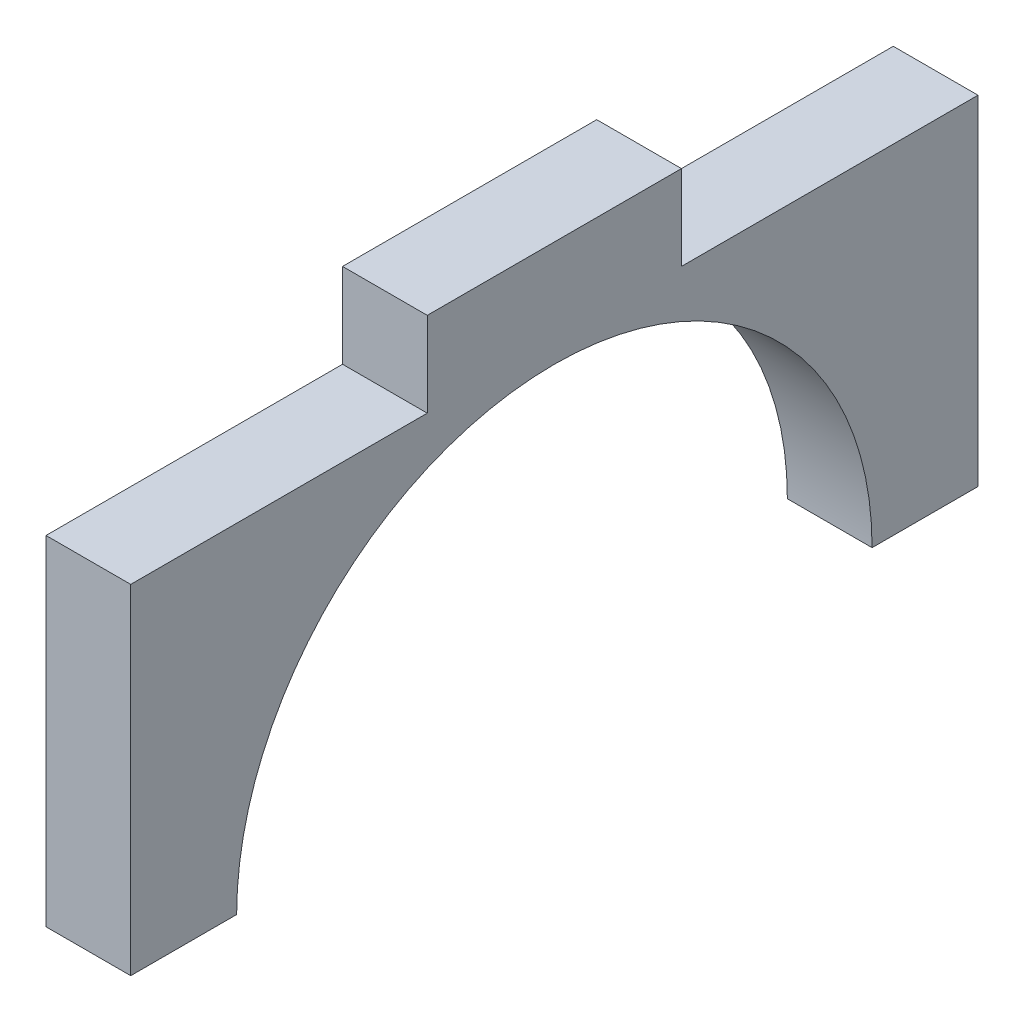
ISO-10303-21;
HEADER;
FILE_DESCRIPTION(('STEP AP214'),'2;1');
FILE_NAME('part.step','',(''),(''),'','','');
FILE_SCHEMA(('AUTOMOTIVE_DESIGN { 1 0 10303 214 1 1 1 1 }'));
ENDSEC;
DATA;
#1=APPLICATION_CONTEXT('core data for automotive mechanical design processes');
#2=APPLICATION_PROTOCOL_DEFINITION('international standard','automotive_design',2000,#1);
#3=PRODUCT_CONTEXT('',#1,'mechanical');
#4=PRODUCT('Part','Part','',(#3));
#5=PRODUCT_RELATED_PRODUCT_CATEGORY('part','',(#4));
#6=PRODUCT_DEFINITION_FORMATION('','',#4);
#7=PRODUCT_DEFINITION_CONTEXT('part definition',#1,'design');
#8=PRODUCT_DEFINITION('design','',#6,#7);
#9=PRODUCT_DEFINITION_SHAPE('','',#8);
#10=(LENGTH_UNIT() NAMED_UNIT(*) SI_UNIT(.MILLI.,.METRE.));
#11=(NAMED_UNIT(*) PLANE_ANGLE_UNIT() SI_UNIT($,.RADIAN.));
#12=(NAMED_UNIT(*) SI_UNIT($,.STERADIAN.) SOLID_ANGLE_UNIT());
#13=UNCERTAINTY_MEASURE_WITH_UNIT(LENGTH_MEASURE(1.E-05),#10,'distance_accuracy_value','');
#14=(GEOMETRIC_REPRESENTATION_CONTEXT(3) GLOBAL_UNCERTAINTY_ASSIGNED_CONTEXT((#13)) GLOBAL_UNIT_ASSIGNED_CONTEXT((#10,
#11,#12)) REPRESENTATION_CONTEXT('',''));
#15=CARTESIAN_POINT('',(0.,0.,0.));
#16=DIRECTION('',(0.,0.,1.));
#17=DIRECTION('',(1.,0.,0.));
#18=AXIS2_PLACEMENT_3D('',#15,#16,#17);
#19=CARTESIAN_POINT('',(3.175,0.,0.));
#20=DIRECTION('',(0.,0.,-1.));
#21=DIRECTION('',(-1.,0.,0.));
#22=AXIS2_PLACEMENT_3D('',#19,#20,#21);
#23=PLANE('',#22);
#24=DIRECTION('',(0.,-1.,0.));
#25=VECTOR('',#24,1.);
#26=CARTESIAN_POINT('',(0.,0.,0.));
#27=LINE('',#26,#25);
#28=CARTESIAN_POINT('',(0.,12.7,0.));
#29=VERTEX_POINT('',#28);
#30=CARTESIAN_POINT('',(0.,0.,0.));
#31=VERTEX_POINT('',#30);
#32=EDGE_CURVE('E141',#29,#31,#27,.T.);
#33=ORIENTED_EDGE('',*,*,#32,.T.);
#34=DIRECTION('',(-1.,0.,0.));
#35=VECTOR('',#34,1.);
#36=CARTESIAN_POINT('',(3.175,0.,0.));
#37=LINE('',#36,#35);
#38=CARTESIAN_POINT('',(3.175,0.,0.));
#39=VERTEX_POINT('',#38);
#40=EDGE_CURVE('E11',#39,#31,#37,.T.);
#41=ORIENTED_EDGE('',*,*,#40,.F.);
#42=DIRECTION('',(0.,-1.,0.));
#43=VECTOR('',#42,1.);
#44=CARTESIAN_POINT('',(3.175,0.,0.));
#45=LINE('',#44,#43);
#46=CARTESIAN_POINT('',(3.175,12.7,0.));
#47=VERTEX_POINT('',#46);
#48=EDGE_CURVE('E159',#47,#39,#45,.T.);
#49=ORIENTED_EDGE('',*,*,#48,.F.);
#50=DIRECTION('',(-1.,0.,0.));
#51=VECTOR('',#50,1.);
#52=CARTESIAN_POINT('',(3.175,12.7,0.));
#53=LINE('',#52,#51);
#54=EDGE_CURVE('E137',#47,#29,#53,.T.);
#55=ORIENTED_EDGE('',*,*,#54,.T.);
#56=EDGE_LOOP('',(#33,#41,#49,#55));
#57=FACE_BOUND('',#56,.T.);
#58=ADVANCED_FACE('F33',(#57),#23,.F.);
#59=CARTESIAN_POINT('',(3.175,0.,0.));
#60=DIRECTION('',(0.,1.,0.));
#61=DIRECTION('',(0.,0.,1.));
#62=AXIS2_PLACEMENT_3D('',#59,#60,#61);
#63=PLANE('',#62);
#64=DIRECTION('',(0.,0.,-1.));
#65=VECTOR('',#64,1.);
#66=CARTESIAN_POINT('',(0.,0.,0.));
#67=LINE('',#66,#65);
#68=CARTESIAN_POINT('',(0.,0.,-3.96875));
#69=VERTEX_POINT('',#68);
#70=EDGE_CURVE('E144',#31,#69,#67,.T.);
#71=ORIENTED_EDGE('',*,*,#70,.T.);
#72=DIRECTION('',(-1.,0.,0.));
#73=VECTOR('',#72,1.);
#74=CARTESIAN_POINT('',(3.175,0.,-3.96875));
#75=LINE('',#74,#73);
#76=CARTESIAN_POINT('',(3.175,0.,-3.96875));
#77=VERTEX_POINT('',#76);
#78=EDGE_CURVE('E41',#77,#69,#75,.T.);
#79=ORIENTED_EDGE('',*,*,#78,.F.);
#80=DIRECTION('',(0.,0.,-1.));
#81=VECTOR('',#80,1.);
#82=CARTESIAN_POINT('',(3.175,0.,0.));
#83=LINE('',#82,#81);
#84=EDGE_CURVE('E98',#39,#77,#83,.T.);
#85=ORIENTED_EDGE('',*,*,#84,.F.);
#86=ORIENTED_EDGE('',*,*,#40,.T.);
#87=EDGE_LOOP('',(#71,#79,#85,#86));
#88=FACE_BOUND('',#87,.T.);
#89=ADVANCED_FACE('F208',(#88),#63,.F.);
#90=CARTESIAN_POINT('',(3.175,0.,-15.875));
#91=DIRECTION('',(-1.,0.,0.));
#92=DIRECTION('',(0.,0.,1.));
#93=AXIS2_PLACEMENT_3D('',#90,#91,#92);
#94=CYLINDRICAL_SURFACE('',#93,11.90625);
#95=CARTESIAN_POINT('',(0.,0.,-15.875));
#96=DIRECTION('',(-1.,0.,0.));
#97=DIRECTION('',(0.,0.,1.));
#98=AXIS2_PLACEMENT_3D('',#95,#96,#97);
#99=CIRCLE('',#98,11.90625);
#100=CARTESIAN_POINT('',(0.,0.,-27.78125));
#101=VERTEX_POINT('',#100);
#102=EDGE_CURVE('E146',#69,#101,#99,.T.);
#103=ORIENTED_EDGE('',*,*,#102,.T.);
#104=DIRECTION('',(-1.,0.,0.));
#105=VECTOR('',#104,1.);
#106=CARTESIAN_POINT('',(3.175,0.,-27.78125));
#107=LINE('',#106,#105);
#108=CARTESIAN_POINT('',(3.175,0.,-27.78125));
#109=VERTEX_POINT('',#108);
#110=EDGE_CURVE('E172',#109,#101,#107,.T.);
#111=ORIENTED_EDGE('',*,*,#110,.F.);
#112=CARTESIAN_POINT('',(3.175,0.,-15.875));
#113=DIRECTION('',(-1.,0.,0.));
#114=DIRECTION('',(0.,0.,1.));
#115=AXIS2_PLACEMENT_3D('',#112,#113,#114);
#116=CIRCLE('',#115,11.90625);
#117=EDGE_CURVE('E180',#77,#109,#116,.T.);
#118=ORIENTED_EDGE('',*,*,#117,.F.);
#119=ORIENTED_EDGE('',*,*,#78,.T.);
#120=EDGE_LOOP('',(#103,#111,#118,#119));
#121=FACE_BOUND('',#120,.T.);
#122=ADVANCED_FACE('F178',(#121),#94,.F.);
#123=CARTESIAN_POINT('',(3.175,0.,-27.78125));
#124=DIRECTION('',(0.,1.,0.));
#125=DIRECTION('',(0.,0.,1.));
#126=AXIS2_PLACEMENT_3D('',#123,#124,#125);
#127=PLANE('',#126);
#128=DIRECTION('',(0.,0.,-1.));
#129=VECTOR('',#128,1.);
#130=CARTESIAN_POINT('',(0.,0.,-27.78125));
#131=LINE('',#130,#129);
#132=CARTESIAN_POINT('',(0.,0.,-31.75));
#133=VERTEX_POINT('',#132);
#134=EDGE_CURVE('E148',#101,#133,#131,.T.);
#135=ORIENTED_EDGE('',*,*,#134,.T.);
#136=DIRECTION('',(-1.,0.,0.));
#137=VECTOR('',#136,1.);
#138=CARTESIAN_POINT('',(3.175,0.,-31.75));
#139=LINE('',#138,#137);
#140=CARTESIAN_POINT('',(3.175,0.,-31.75));
#141=VERTEX_POINT('',#140);
#142=EDGE_CURVE('E169',#141,#133,#139,.T.);
#143=ORIENTED_EDGE('',*,*,#142,.F.);
#144=DIRECTION('',(0.,0.,-1.));
#145=VECTOR('',#144,1.);
#146=CARTESIAN_POINT('',(3.175,0.,-27.78125));
#147=LINE('',#146,#145);
#148=EDGE_CURVE('E198',#109,#141,#147,.T.);
#149=ORIENTED_EDGE('',*,*,#148,.F.);
#150=ORIENTED_EDGE('',*,*,#110,.T.);
#151=EDGE_LOOP('',(#135,#143,#149,#150));
#152=FACE_BOUND('',#151,.T.);
#153=ADVANCED_FACE('F189',(#152),#127,.F.);
#154=CARTESIAN_POINT('',(3.175,0.,-31.75));
#155=DIRECTION('',(0.,0.,1.));
#156=DIRECTION('',(1.,0.,0.));
#157=AXIS2_PLACEMENT_3D('',#154,#155,#156);
#158=PLANE('',#157);
#159=DIRECTION('',(0.,1.,0.));
#160=VECTOR('',#159,1.);
#161=CARTESIAN_POINT('',(0.,0.,-31.75));
#162=LINE('',#161,#160);
#163=CARTESIAN_POINT('',(0.,12.7,-31.75));
#164=VERTEX_POINT('',#163);
#165=EDGE_CURVE('E150',#133,#164,#162,.T.);
#166=ORIENTED_EDGE('',*,*,#165,.T.);
#167=DIRECTION('',(-1.,0.,0.));
#168=VECTOR('',#167,1.);
#169=CARTESIAN_POINT('',(3.175,12.7,-31.75));
#170=LINE('',#169,#168);
#171=CARTESIAN_POINT('',(3.175,12.7,-31.75));
#172=VERTEX_POINT('',#171);
#173=EDGE_CURVE('E166',#172,#164,#170,.T.);
#174=ORIENTED_EDGE('',*,*,#173,.F.);
#175=DIRECTION('',(0.,1.,0.));
#176=VECTOR('',#175,1.);
#177=CARTESIAN_POINT('',(3.175,0.,-31.75));
#178=LINE('',#177,#176);
#179=EDGE_CURVE('E195',#141,#172,#178,.T.);
#180=ORIENTED_EDGE('',*,*,#179,.F.);
#181=ORIENTED_EDGE('',*,*,#142,.T.);
#182=EDGE_LOOP('',(#166,#174,#180,#181));
#183=FACE_BOUND('',#182,.T.);
#184=ADVANCED_FACE('F193',(#183),#158,.F.);
#185=CARTESIAN_POINT('',(3.175,12.7,-20.6375));
#186=DIRECTION('',(0.,-1.,0.));
#187=DIRECTION('',(0.,0.,-1.));
#188=AXIS2_PLACEMENT_3D('',#185,#186,#187);
#189=PLANE('',#188);
#190=DIRECTION('',(0.,0.,1.));
#191=VECTOR('',#190,1.);
#192=CARTESIAN_POINT('',(0.,12.7,-20.6375));
#193=LINE('',#192,#191);
#194=CARTESIAN_POINT('',(0.,12.7,-20.6375));
#195=VERTEX_POINT('',#194);
#196=EDGE_CURVE('E152',#164,#195,#193,.T.);
#197=ORIENTED_EDGE('',*,*,#196,.T.);
#198=DIRECTION('',(-1.,0.,0.));
#199=VECTOR('',#198,1.);
#200=CARTESIAN_POINT('',(3.175,12.7,-20.6375));
#201=LINE('',#200,#199);
#202=CARTESIAN_POINT('',(3.175,12.7,-20.6375));
#203=VERTEX_POINT('',#202);
#204=EDGE_CURVE('E163',#203,#195,#201,.T.);
#205=ORIENTED_EDGE('',*,*,#204,.F.);
#206=DIRECTION('',(0.,0.,1.));
#207=VECTOR('',#206,1.);
#208=CARTESIAN_POINT('',(3.175,12.7,-20.6375));
#209=LINE('',#208,#207);
#210=EDGE_CURVE('E197',#172,#203,#209,.T.);
#211=ORIENTED_EDGE('',*,*,#210,.F.);
#212=ORIENTED_EDGE('',*,*,#173,.T.);
#213=EDGE_LOOP('',(#197,#205,#211,#212));
#214=FACE_BOUND('',#213,.T.);
#215=ADVANCED_FACE('F220',(#214),#189,.F.);
#216=CARTESIAN_POINT('',(3.175,15.875,-20.6375));
#217=DIRECTION('',(0.,0.,1.));
#218=DIRECTION('',(0.,-1.,0.));
#219=AXIS2_PLACEMENT_3D('',#216,#217,#218);
#220=PLANE('',#219);
#221=DIRECTION('',(0.,1.,0.));
#222=VECTOR('',#221,1.);
#223=CARTESIAN_POINT('',(0.,15.875,-20.6375));
#224=LINE('',#223,#222);
#225=CARTESIAN_POINT('',(0.,15.875,-20.6375));
#226=VERTEX_POINT('',#225);
#227=EDGE_CURVE('E154',#195,#226,#224,.T.);
#228=ORIENTED_EDGE('',*,*,#227,.T.);
#229=DIRECTION('',(-1.,0.,0.));
#230=VECTOR('',#229,1.);
#231=CARTESIAN_POINT('',(3.175,15.875,-20.6375));
#232=LINE('',#231,#230);
#233=CARTESIAN_POINT('',(3.175,15.875,-20.6375));
#234=VERTEX_POINT('',#233);
#235=EDGE_CURVE('E132',#234,#226,#232,.T.);
#236=ORIENTED_EDGE('',*,*,#235,.F.);
#237=DIRECTION('',(0.,1.,0.));
#238=VECTOR('',#237,1.);
#239=CARTESIAN_POINT('',(3.175,15.875,-20.6375));
#240=LINE('',#239,#238);
#241=EDGE_CURVE('E123',#203,#234,#240,.T.);
#242=ORIENTED_EDGE('',*,*,#241,.F.);
#243=ORIENTED_EDGE('',*,*,#204,.T.);
#244=EDGE_LOOP('',(#228,#236,#242,#243));
#245=FACE_BOUND('',#244,.T.);
#246=ADVANCED_FACE('F223',(#245),#220,.F.);
#247=CARTESIAN_POINT('',(3.175,15.875,-11.1125));
#248=DIRECTION('',(0.,-1.,0.));
#249=DIRECTION('',(0.,0.,-1.));
#250=AXIS2_PLACEMENT_3D('',#247,#248,#249);
#251=PLANE('',#250);
#252=DIRECTION('',(0.,0.,1.));
#253=VECTOR('',#252,1.);
#254=CARTESIAN_POINT('',(0.,15.875,-11.1125));
#255=LINE('',#254,#253);
#256=CARTESIAN_POINT('',(0.,15.875,-11.1125));
#257=VERTEX_POINT('',#256);
#258=EDGE_CURVE('E131',#226,#257,#255,.T.);
#259=ORIENTED_EDGE('',*,*,#258,.T.);
#260=DIRECTION('',(-1.,0.,0.));
#261=VECTOR('',#260,1.);
#262=CARTESIAN_POINT('',(3.175,15.875,-11.1125));
#263=LINE('',#262,#261);
#264=CARTESIAN_POINT('',(3.175,15.875,-11.1125));
#265=VERTEX_POINT('',#264);
#266=EDGE_CURVE('E128',#265,#257,#263,.T.);
#267=ORIENTED_EDGE('',*,*,#266,.F.);
#268=DIRECTION('',(0.,0.,1.));
#269=VECTOR('',#268,1.);
#270=CARTESIAN_POINT('',(3.175,15.875,-11.1125));
#271=LINE('',#270,#269);
#272=EDGE_CURVE('E117',#234,#265,#271,.T.);
#273=ORIENTED_EDGE('',*,*,#272,.F.);
#274=ORIENTED_EDGE('',*,*,#235,.T.);
#275=EDGE_LOOP('',(#259,#267,#273,#274));
#276=FACE_BOUND('',#275,.T.);
#277=ADVANCED_FACE('F129',(#276),#251,.F.);
#278=CARTESIAN_POINT('',(3.175,12.7,-11.1125));
#279=DIRECTION('',(0.,0.,-1.));
#280=DIRECTION('',(0.,1.,0.));
#281=AXIS2_PLACEMENT_3D('',#278,#279,#280);
#282=PLANE('',#281);
#283=DIRECTION('',(0.,-1.,0.));
#284=VECTOR('',#283,1.);
#285=CARTESIAN_POINT('',(0.,12.7,-11.1125));
#286=LINE('',#285,#284);
#287=CARTESIAN_POINT('',(0.,12.7,-11.1125));
#288=VERTEX_POINT('',#287);
#289=EDGE_CURVE('E84',#257,#288,#286,.T.);
#290=ORIENTED_EDGE('',*,*,#289,.T.);
#291=DIRECTION('',(-1.,0.,0.));
#292=VECTOR('',#291,1.);
#293=CARTESIAN_POINT('',(3.175,12.7,-11.1125));
#294=LINE('',#293,#292);
#295=CARTESIAN_POINT('',(3.175,12.7,-11.1125));
#296=VERTEX_POINT('',#295);
#297=EDGE_CURVE('E133',#296,#288,#294,.T.);
#298=ORIENTED_EDGE('',*,*,#297,.F.);
#299=DIRECTION('',(0.,-1.,0.));
#300=VECTOR('',#299,1.);
#301=CARTESIAN_POINT('',(3.175,12.7,-11.1125));
#302=LINE('',#301,#300);
#303=EDGE_CURVE('E121',#265,#296,#302,.T.);
#304=ORIENTED_EDGE('',*,*,#303,.F.);
#305=ORIENTED_EDGE('',*,*,#266,.T.);
#306=EDGE_LOOP('',(#290,#298,#304,#305));
#307=FACE_BOUND('',#306,.T.);
#308=ADVANCED_FACE('F135',(#307),#282,.F.);
#309=CARTESIAN_POINT('',(3.175,12.7,0.));
#310=DIRECTION('',(0.,-1.,0.));
#311=DIRECTION('',(0.,0.,-1.));
#312=AXIS2_PLACEMENT_3D('',#309,#310,#311);
#313=PLANE('',#312);
#314=DIRECTION('',(0.,0.,1.));
#315=VECTOR('',#314,1.);
#316=CARTESIAN_POINT('',(0.,12.7,0.));
#317=LINE('',#316,#315);
#318=EDGE_CURVE('E90',#288,#29,#317,.T.);
#319=ORIENTED_EDGE('',*,*,#318,.T.);
#320=ORIENTED_EDGE('',*,*,#54,.F.);
#321=DIRECTION('',(0.,0.,1.));
#322=VECTOR('',#321,1.);
#323=CARTESIAN_POINT('',(3.175,12.7,0.));
#324=LINE('',#323,#322);
#325=EDGE_CURVE('E49',#296,#47,#324,.T.);
#326=ORIENTED_EDGE('',*,*,#325,.F.);
#327=ORIENTED_EDGE('',*,*,#297,.T.);
#328=EDGE_LOOP('',(#319,#320,#326,#327));
#329=FACE_BOUND('',#328,.T.);
#330=ADVANCED_FACE('F232',(#329),#313,.F.);
#331=CARTESIAN_POINT('',(3.175,0.,-15.875));
#332=DIRECTION('',(-1.,0.,0.));
#333=DIRECTION('',(0.,0.,1.));
#334=AXIS2_PLACEMENT_3D('',#331,#332,#333);
#335=PLANE('',#334);
#336=ORIENTED_EDGE('',*,*,#48,.T.);
#337=ORIENTED_EDGE('',*,*,#84,.T.);
#338=ORIENTED_EDGE('',*,*,#117,.T.);
#339=ORIENTED_EDGE('',*,*,#148,.T.);
#340=ORIENTED_EDGE('',*,*,#179,.T.);
#341=ORIENTED_EDGE('',*,*,#210,.T.);
#342=ORIENTED_EDGE('',*,*,#241,.T.);
#343=ORIENTED_EDGE('',*,*,#272,.T.);
#344=ORIENTED_EDGE('',*,*,#303,.T.);
#345=ORIENTED_EDGE('',*,*,#325,.T.);
#346=EDGE_LOOP('',(#336,#337,#338,#339,#340,#341,#342,#343,#344,#345));
#347=FACE_BOUND('',#346,.T.);
#348=ADVANCED_FACE('F119',(#347),#335,.F.);
#349=CARTESIAN_POINT('',(0.,0.,-15.875));
#350=DIRECTION('',(-1.,0.,0.));
#351=DIRECTION('',(0.,0.,1.));
#352=AXIS2_PLACEMENT_3D('',#349,#350,#351);
#353=PLANE('',#352);
#354=ORIENTED_EDGE('',*,*,#32,.F.);
#355=ORIENTED_EDGE('',*,*,#318,.F.);
#356=ORIENTED_EDGE('',*,*,#289,.F.);
#357=ORIENTED_EDGE('',*,*,#258,.F.);
#358=ORIENTED_EDGE('',*,*,#227,.F.);
#359=ORIENTED_EDGE('',*,*,#196,.F.);
#360=ORIENTED_EDGE('',*,*,#165,.F.);
#361=ORIENTED_EDGE('',*,*,#134,.F.);
#362=ORIENTED_EDGE('',*,*,#102,.F.);
#363=ORIENTED_EDGE('',*,*,#70,.F.);
#364=EDGE_LOOP('',(#354,#355,#356,#357,#358,#359,#360,#361,#362,#363));
#365=FACE_BOUND('',#364,.T.);
#366=ADVANCED_FACE('F184',(#365),#353,.T.);
#367=CLOSED_SHELL('',(#58,#89,#122,#153,#184,#215,#246,#277,#308,#330,#348,#366));
#368=MANIFOLD_SOLID_BREP('B2',#367);
#369=ADVANCED_BREP_SHAPE_REPRESENTATION('',(#18,#368),#14);
#370=SHAPE_DEFINITION_REPRESENTATION(#9,#369);
ENDSEC;
END-ISO-10303-21;
